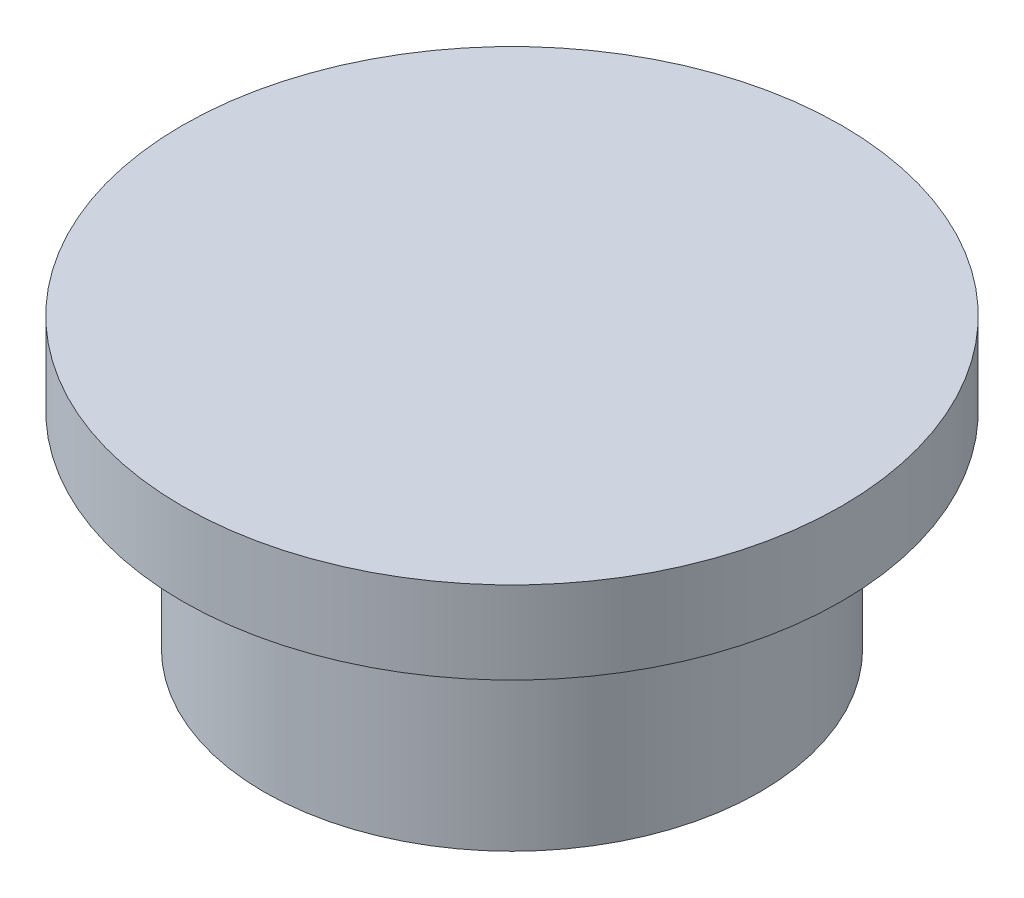
ISO-10303-21;
HEADER;
FILE_DESCRIPTION(('STEP AP214'),'2;1');
FILE_NAME('part.step','',(''),(''),'','','');
FILE_SCHEMA(('AUTOMOTIVE_DESIGN { 1 0 10303 214 1 1 1 1 }'));
ENDSEC;
DATA;
#1=APPLICATION_CONTEXT('core data for automotive mechanical design processes');
#2=APPLICATION_PROTOCOL_DEFINITION('international standard','automotive_design',2000,#1);
#3=PRODUCT_CONTEXT('',#1,'mechanical');
#4=PRODUCT('Part','Part','',(#3));
#5=PRODUCT_RELATED_PRODUCT_CATEGORY('part','',(#4));
#6=PRODUCT_DEFINITION_FORMATION('','',#4);
#7=PRODUCT_DEFINITION_CONTEXT('part definition',#1,'design');
#8=PRODUCT_DEFINITION('design','',#6,#7);
#9=PRODUCT_DEFINITION_SHAPE('','',#8);
#10=(LENGTH_UNIT() NAMED_UNIT(*) SI_UNIT(.MILLI.,.METRE.));
#11=(NAMED_UNIT(*) PLANE_ANGLE_UNIT() SI_UNIT($,.RADIAN.));
#12=(NAMED_UNIT(*) SI_UNIT($,.STERADIAN.) SOLID_ANGLE_UNIT());
#13=UNCERTAINTY_MEASURE_WITH_UNIT(LENGTH_MEASURE(1.E-05),#10,'distance_accuracy_value','');
#14=(GEOMETRIC_REPRESENTATION_CONTEXT(3) GLOBAL_UNCERTAINTY_ASSIGNED_CONTEXT((#13)) GLOBAL_UNIT_ASSIGNED_CONTEXT((#10,
#11,#12)) REPRESENTATION_CONTEXT('',''));
#15=CARTESIAN_POINT('',(0.,0.,0.));
#16=DIRECTION('',(0.,0.,1.));
#17=DIRECTION('',(1.,0.,0.));
#18=AXIS2_PLACEMENT_3D('',#15,#16,#17);
#19=CARTESIAN_POINT('',(0.,0.,0.));
#20=DIRECTION('',(0.,1.,0.));
#21=DIRECTION('',(0.,0.,1.));
#22=AXIS2_PLACEMENT_3D('',#19,#20,#21);
#23=PLANE('',#22);
#24=CARTESIAN_POINT('',(0.,0.,0.));
#25=DIRECTION('',(0.,-1.,0.));
#26=DIRECTION('',(0.,0.,-1.));
#27=AXIS2_PLACEMENT_3D('',#24,#25,#26);
#28=CIRCLE('',#27,3.175);
#29=CARTESIAN_POINT('',(0.,0.,-3.175));
#30=VERTEX_POINT('',#29);
#31=EDGE_CURVE('E10',#30,#30,#28,.T.);
#32=ORIENTED_EDGE('',*,*,#31,.F.);
#33=EDGE_LOOP('',(#32));
#34=FACE_BOUND('',#33,.T.);
#35=ADVANCED_FACE('F43',(#34),#23,.T.);
#36=CARTESIAN_POINT('',(0.,1.48865602741708,0.));
#37=DIRECTION('',(0.,-1.,0.));
#38=DIRECTION('',(0.,0.,-1.));
#39=AXIS2_PLACEMENT_3D('',#36,#37,#38);
#40=CYLINDRICAL_SURFACE('',#39,3.175);
#41=ORIENTED_EDGE('',*,*,#31,.T.);
#42=EDGE_LOOP('',(#41));
#43=FACE_BOUND('',#42,.T.);
#44=CARTESIAN_POINT('',(0.,-0.79375,0.));
#45=DIRECTION('',(0.,-1.,0.));
#46=DIRECTION('',(0.,0.,-1.));
#47=AXIS2_PLACEMENT_3D('',#44,#45,#46);
#48=CIRCLE('',#47,3.175);
#49=CARTESIAN_POINT('',(0.,-0.79375,-3.175));
#50=VERTEX_POINT('',#49);
#51=EDGE_CURVE('E50',#50,#50,#48,.T.);
#52=ORIENTED_EDGE('',*,*,#51,.F.);
#53=EDGE_LOOP('',(#52));
#54=FACE_BOUND('',#53,.T.);
#55=ADVANCED_FACE('F79',(#43,#54),#40,.T.);
#56=CARTESIAN_POINT('',(3.175,-0.79375,0.));
#57=DIRECTION('',(0.,-1.,0.));
#58=DIRECTION('',(0.,0.,-1.));
#59=AXIS2_PLACEMENT_3D('',#56,#57,#58);
#60=PLANE('',#59);
#61=ORIENTED_EDGE('',*,*,#51,.T.);
#62=EDGE_LOOP('',(#61));
#63=FACE_BOUND('',#62,.T.);
#64=CARTESIAN_POINT('',(0.,-0.79375,0.));
#65=DIRECTION('',(0.,-1.,0.));
#66=DIRECTION('',(0.,0.,-1.));
#67=AXIS2_PLACEMENT_3D('',#64,#65,#66);
#68=CIRCLE('',#67,2.3876);
#69=CARTESIAN_POINT('',(0.,-0.79375,-2.3876));
#70=VERTEX_POINT('',#69);
#71=EDGE_CURVE('E55',#70,#70,#68,.T.);
#72=ORIENTED_EDGE('',*,*,#71,.F.);
#73=EDGE_LOOP('',(#72));
#74=FACE_BOUND('',#73,.T.);
#75=ADVANCED_FACE('F71',(#63,#74),#60,.T.);
#76=CARTESIAN_POINT('',(0.,1.48865602741708,0.));
#77=DIRECTION('',(0.,-1.,0.));
#78=DIRECTION('',(0.,0.,-1.));
#79=AXIS2_PLACEMENT_3D('',#76,#77,#78);
#80=CYLINDRICAL_SURFACE('',#79,2.3876);
#81=ORIENTED_EDGE('',*,*,#71,.T.);
#82=EDGE_LOOP('',(#81));
#83=FACE_BOUND('',#82,.T.);
#84=CARTESIAN_POINT('',(0.,-2.778125,0.));
#85=DIRECTION('',(0.,-1.,0.));
#86=DIRECTION('',(0.,0.,-1.));
#87=AXIS2_PLACEMENT_3D('',#84,#85,#86);
#88=CIRCLE('',#87,2.3876);
#89=CARTESIAN_POINT('',(0.,-2.778125,-2.3876));
#90=VERTEX_POINT('',#89);
#91=EDGE_CURVE('E60',#90,#90,#88,.T.);
#92=ORIENTED_EDGE('',*,*,#91,.F.);
#93=EDGE_LOOP('',(#92));
#94=FACE_BOUND('',#93,.T.);
#95=ADVANCED_FACE('F69',(#83,#94),#80,.T.);
#96=CARTESIAN_POINT('',(2.3876,-2.778125,0.));
#97=DIRECTION('',(0.,-1.,0.));
#98=DIRECTION('',(0.,0.,-1.));
#99=AXIS2_PLACEMENT_3D('',#96,#97,#98);
#100=PLANE('',#99);
#101=ORIENTED_EDGE('',*,*,#91,.T.);
#102=EDGE_LOOP('',(#101));
#103=FACE_BOUND('',#102,.T.);
#104=ADVANCED_FACE('F67',(#103),#100,.T.);
#105=CLOSED_SHELL('',(#35,#55,#75,#95,#104));
#106=MANIFOLD_SOLID_BREP('B2',#105);
#107=ADVANCED_BREP_SHAPE_REPRESENTATION('',(#18,#106),#14);
#108=SHAPE_DEFINITION_REPRESENTATION(#9,#107);
ENDSEC;
END-ISO-10303-21;
